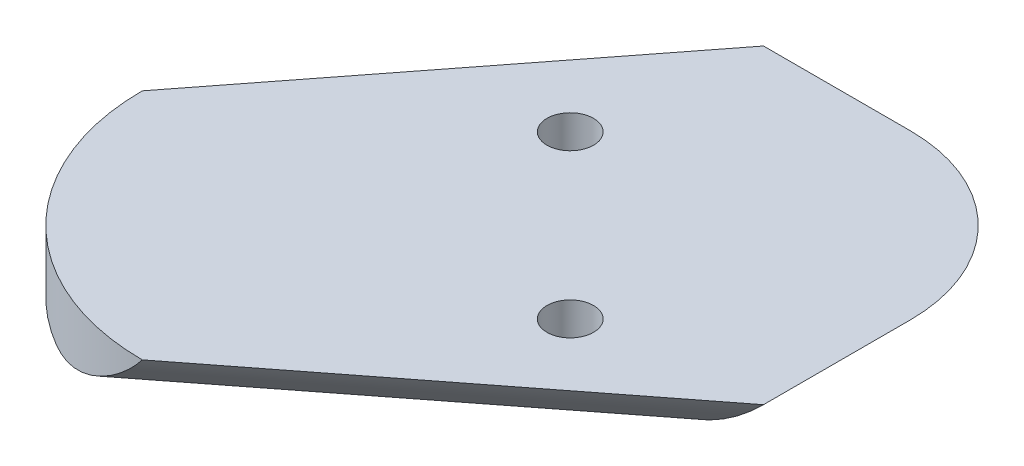
ISO-10303-21;
HEADER;
FILE_DESCRIPTION(('STEP AP214'),'2;1');
FILE_NAME('part.step','',(''),(''),'','','');
FILE_SCHEMA(('AUTOMOTIVE_DESIGN { 1 0 10303 214 1 1 1 1 }'));
ENDSEC;
DATA;
#1=APPLICATION_CONTEXT('core data for automotive mechanical design processes');
#2=APPLICATION_PROTOCOL_DEFINITION('international standard','automotive_design',2000,#1);
#3=PRODUCT_CONTEXT('',#1,'mechanical');
#4=PRODUCT('Part','Part','',(#3));
#5=PRODUCT_RELATED_PRODUCT_CATEGORY('part','',(#4));
#6=PRODUCT_DEFINITION_FORMATION('','',#4);
#7=PRODUCT_DEFINITION_CONTEXT('part definition',#1,'design');
#8=PRODUCT_DEFINITION('design','',#6,#7);
#9=PRODUCT_DEFINITION_SHAPE('','',#8);
#10=(LENGTH_UNIT() NAMED_UNIT(*) SI_UNIT(.MILLI.,.METRE.));
#11=(NAMED_UNIT(*) PLANE_ANGLE_UNIT() SI_UNIT($,.RADIAN.));
#12=(NAMED_UNIT(*) SI_UNIT($,.STERADIAN.) SOLID_ANGLE_UNIT());
#13=UNCERTAINTY_MEASURE_WITH_UNIT(LENGTH_MEASURE(1.E-05),#10,'distance_accuracy_value','');
#14=(GEOMETRIC_REPRESENTATION_CONTEXT(3) GLOBAL_UNCERTAINTY_ASSIGNED_CONTEXT((#13)) GLOBAL_UNIT_ASSIGNED_CONTEXT((#10,
#11,#12)) REPRESENTATION_CONTEXT('',''));
#15=CARTESIAN_POINT('',(0.,0.,0.));
#16=DIRECTION('',(0.,0.,1.));
#17=DIRECTION('',(1.,0.,0.));
#18=AXIS2_PLACEMENT_3D('',#15,#16,#17);
#19=CARTESIAN_POINT('',(-25.,8.,25.));
#20=DIRECTION('',(0.,-1.,0.));
#21=DIRECTION('',(0.,0.,-1.));
#22=AXIS2_PLACEMENT_3D('',#19,#20,#21);
#23=CYLINDRICAL_SURFACE('',#22,30.);
#24=CARTESIAN_POINT('',(-25.,8.,25.));
#25=DIRECTION('',(0.,1.,0.));
#26=DIRECTION('',(0.,0.,1.));
#27=AXIS2_PLACEMENT_3D('',#24,#25,#26);
#28=CIRCLE('',#27,30.);
#29=CARTESIAN_POINT('',(-55.,8.,25.));
#30=VERTEX_POINT('',#29);
#31=CARTESIAN_POINT('',(-25.,8.,55.));
#32=VERTEX_POINT('',#31);
#33=EDGE_CURVE('E107',#30,#32,#28,.T.);
#34=ORIENTED_EDGE('',*,*,#33,.F.);
#35=CARTESIAN_POINT('',(-55.,8.,25.));
#36=CARTESIAN_POINT('',(-55.0000149337181,7.76366710785229,25.1826639288907));
#37=CARTESIAN_POINT('',(-54.9983328483194,7.5326924174558,25.3721243054726));
#38=CARTESIAN_POINT('',(-54.9909311101144,7.08119971930185,25.7628691667828));
#39=CARTESIAN_POINT('',(-54.9852132248712,6.8606771789109,25.9641484398091));
#40=CARTESIAN_POINT('',(-54.9691065514288,6.42986492629269,26.3766933030417));
#41=CARTESIAN_POINT('',(-54.9587230177196,6.21956399685019,26.5879474206405));
#42=CARTESIAN_POINT('',(-54.9327390787841,5.80864267595741,27.0193740201955));
#43=CARTESIAN_POINT('',(-54.9171380086402,5.60802352207357,27.2395476356987));
#44=CARTESIAN_POINT('',(-54.8614996349122,5.01782538355453,27.9146745524815));
#45=CARTESIAN_POINT('',(-54.8127149467977,4.64261384498823,28.3816072991131));
#46=CARTESIAN_POINT('',(-54.6883335452686,3.929935906382,29.3401301031353));
#47=CARTESIAN_POINT('',(-54.6127290996289,3.5924804284846,29.8317272362215));
#48=CARTESIAN_POINT('',(-54.4418864734662,2.99224401711152,30.7774985448942));
#49=CARTESIAN_POINT('',(-54.3498297468502,2.7253337202278,31.2296294283354));
#50=CARTESIAN_POINT('',(-54.1403680596482,2.22356097345311,32.1455999375864));
#51=CARTESIAN_POINT('',(-54.0229677738494,1.98869262623428,32.6094373901267));
#52=CARTESIAN_POINT('',(-53.7618390615891,1.55423119319321,33.5434602960041));
#53=CARTESIAN_POINT('',(-53.6182326042672,1.35448277501645,34.0136073614406));
#54=CARTESIAN_POINT('',(-53.3031729899518,0.991906905351658,34.9588354235181));
#55=CARTESIAN_POINT('',(-53.131723935377,0.829074023065014,35.4339156836477));
#56=CARTESIAN_POINT('',(-52.803655130755,0.577040831124523,36.274318537783));
#57=CARTESIAN_POINT('',(-52.6528760801568,0.479523761588807,36.6394433949175));
#58=CARTESIAN_POINT('',(-52.3346787439705,0.310018018249884,37.3682390112918));
#59=CARTESIAN_POINT('',(-52.1672668919756,0.238019522662679,37.7319102765983));
#60=CARTESIAN_POINT('',(-51.8150361214636,0.120938529084424,38.4579917114956));
#61=CARTESIAN_POINT('',(-51.6301186388317,0.0760203870469298,38.8203811680424));
#62=CARTESIAN_POINT('',(-51.3409067021667,0.0306647178497149,39.3596086406653));
#63=CARTESIAN_POINT('',(-51.2424686405056,0.0192161762753081,39.5387292120168));
#64=CARTESIAN_POINT('',(-51.0417999204024,0.00388325095041707,39.895184239232));
#65=CARTESIAN_POINT('',(-50.9395688597326,-3.28225569687759E-07,40.0725185031171));
#66=CARTESIAN_POINT('',(-50.8355137729064,0.,40.2488107106739));
#67=B_SPLINE_CURVE_WITH_KNOTS('',3,(#35,#36,#37,#38,#39,#40,#41,#42,#43,#44,#45,#46,#47,#48,#49,
#50,#51,#52,#53,#54,#55,#56,#57,#58,#59,#60,#61,#62,#63,#64,#65,#66),.UNSPECIFIED.,.F.,.F.,(4,2,
2,2,2,2,2,2,2,2,2,2,2,2,2,4),(0.,0.895836012346807,1.79127991780151,2.68571788510424,
3.5802698821434,5.38065166809804,7.18155293250976,8.77907749719142,10.3763076393121,
11.9662852153713,13.5560287311848,14.7756521725298,15.994805684811,17.2212858803042,
17.8352495380648,18.4492784906028),.UNSPECIFIED.);
#68=CARTESIAN_POINT('',(-50.8355137729064,0.,40.2488107106739));
#69=VERTEX_POINT('',#68);
#70=EDGE_CURVE('E150',#30,#69,#67,.T.);
#71=ORIENTED_EDGE('',*,*,#70,.T.);
#72=CARTESIAN_POINT('',(-25.,0.,25.));
#73=DIRECTION('',(0.,1.,0.));
#74=DIRECTION('',(0.,0.,1.));
#75=AXIS2_PLACEMENT_3D('',#72,#73,#74);
#76=CIRCLE('',#75,30.);
#77=CARTESIAN_POINT('',(-40.2488107106739,0.,50.8355137729064));
#78=VERTEX_POINT('',#77);
#79=EDGE_CURVE('E109',#69,#78,#76,.T.);
#80=ORIENTED_EDGE('',*,*,#79,.T.);
#81=CARTESIAN_POINT('',(-40.2488107106739,0.,50.8355137729064));
#82=CARTESIAN_POINT('',(-40.051615194468,-4.48527421998889E-07,50.9519080136923));
#83=CARTESIAN_POINT('',(-39.8531197647859,0.00485885932003756,51.0660159615653));
#84=CARTESIAN_POINT('',(-39.4539463294067,0.0240123220044344,51.2894601317774));
#85=CARTESIAN_POINT('',(-39.2532686435908,0.038305111912048,51.3987970419978));
#86=CARTESIAN_POINT('',(-38.6490479020251,0.0948578754571697,51.7191125787953));
#87=CARTESIAN_POINT('',(-38.2427808139363,0.150793813567319,51.9227123148687));
#88=CARTESIAN_POINT('',(-37.4300547630347,0.296018579970776,52.3074040892245));
#89=CARTESIAN_POINT('',(-37.0236266216139,0.385020652851024,52.4886722965869));
#90=CARTESIAN_POINT('',(-36.2098924619952,0.593987771074424,52.8304346285862));
#91=CARTESIAN_POINT('',(-35.8025862290288,0.713961518406383,52.9909228957057));
#92=CARTESIAN_POINT('',(-34.9917754515233,0.9818815068822,53.2904641353349));
#93=CARTESIAN_POINT('',(-34.5882620405258,1.1296915218013,53.4296157488899));
#94=CARTESIAN_POINT('',(-33.7853994673645,1.45157647322055,53.6878821199211));
#95=CARTESIAN_POINT('',(-33.3860500161629,1.62564957353909,53.8069982769445));
#96=CARTESIAN_POINT('',(-32.5920663387716,1.99903005810294,54.0263813601196));
#97=CARTESIAN_POINT('',(-32.1974561136947,2.19843179361472,54.1265741335443));
#98=CARTESIAN_POINT('',(-31.4165477532986,2.62053075620023,54.3085086396697));
#99=CARTESIAN_POINT('',(-31.0302499819026,2.84322900071442,54.3902495660207));
#100=CARTESIAN_POINT('',(-30.1980729428415,3.35380830165616,54.5498030416914));
#101=CARTESIAN_POINT('',(-29.7542587362562,3.64615351348757,54.6241461520196));
#102=CARTESIAN_POINT('',(-28.8846578843716,4.26123855302292,54.7506727500767));
#103=CARTESIAN_POINT('',(-28.4588782204883,4.58398999829307,54.8028477255438));
#104=CARTESIAN_POINT('',(-27.6314262808204,5.25860444306934,54.8872535752973));
#105=CARTESIAN_POINT('',(-27.2296749413833,5.61036174155972,54.9195535254605));
#106=CARTESIAN_POINT('',(-26.4546607285204,6.34468331017928,54.9672202337607));
#107=CARTESIAN_POINT('',(-26.0813719094781,6.72721885370768,54.9826025894755));
#108=CARTESIAN_POINT('',(-25.600378262749,7.26749638442816,54.9942582425137));
#109=CARTESIAN_POINT('',(-25.4766987266299,7.41104918469624,54.9964573374619));
#110=CARTESIAN_POINT('',(-25.23442755038,7.70234331613614,54.9993283430818));
#111=CARTESIAN_POINT('',(-25.1158347772122,7.85008370225097,55.0000005955972));
#112=CARTESIAN_POINT('',(-25.,8.,55.));
#113=B_SPLINE_CURVE_WITH_KNOTS('',3,(#81,#82,#83,#84,#85,#86,#87,#88,#89,#90,#91,#92,#93,#94,
#95,#96,#97,#98,#99,#100,#101,#102,#103,#104,#105,#106,#107,#108,#109,#110,#111,#112),
.UNSPECIFIED.,.F.,.F.,(4,2,2,2,2,2,2,2,2,2,2,2,2,2,2,4),(0.,0.68680716080374,1.37351496934495,
2.74506990704209,4.1049980362695,5.4653086757702,6.81912747169389,8.1728516593039,
9.5317751917251,10.8907580979119,12.4989613489588,14.1077815712638,15.7109782633747,
17.3126956078892,17.8810866326439,18.4493503881755),.UNSPECIFIED.);
#114=EDGE_CURVE('E137',#78,#32,#113,.T.);
#115=ORIENTED_EDGE('',*,*,#114,.T.);
#116=EDGE_LOOP('',(#34,#71,#80,#115));
#117=FACE_BOUND('',#116,.T.);
#118=ADVANCED_FACE('F39',(#117),#23,.T.);
#119=CARTESIAN_POINT('',(-1.082,8.,1.082));
#120=DIRECTION('',(0.,-1.,0.));
#121=DIRECTION('',(0.,0.,-1.));
#122=AXIS2_PLACEMENT_3D('',#119,#120,#121);
#123=PLANE('',#122);
#124=CARTESIAN_POINT('',(-22.88,8.,2.01));
#125=DIRECTION('',(0.,1.,0.));
#126=DIRECTION('',(0.,0.,1.));
#127=AXIS2_PLACEMENT_3D('',#124,#125,#126);
#128=CIRCLE('',#127,3.);
#129=CARTESIAN_POINT('',(-22.88,8.,5.01000000000001));
#130=VERTEX_POINT('',#129);
#131=EDGE_CURVE('E215',#130,#130,#128,.T.);
#132=ORIENTED_EDGE('',*,*,#131,.F.);
#133=EDGE_LOOP('',(#132));
#134=FACE_BOUND('',#133,.T.);
#135=CARTESIAN_POINT('',(-2.01,8.,22.88));
#136=DIRECTION('',(0.,1.,0.));
#137=DIRECTION('',(0.,0.,1.));
#138=AXIS2_PLACEMENT_3D('',#135,#136,#137);
#139=CIRCLE('',#138,3.);
#140=CARTESIAN_POINT('',(-2.01,8.,25.88));
#141=VERTEX_POINT('',#140);
#142=EDGE_CURVE('E214',#141,#141,#139,.T.);
#143=ORIENTED_EDGE('',*,*,#142,.F.);
#144=EDGE_LOOP('',(#143));
#145=FACE_BOUND('',#144,.T.);
#146=DIRECTION('',(0.789352217376326,0.,-0.61394061351492));
#147=VECTOR('',#146,1.);
#148=CARTESIAN_POINT('',(-25.,8.,55.));
#149=LINE('',#148,#147);
#150=CARTESIAN_POINT('',(20.,8.,20.));
#151=VERTEX_POINT('',#150);
#152=EDGE_CURVE('E99',#32,#151,#149,.T.);
#153=ORIENTED_EDGE('',*,*,#152,.T.);
#154=DIRECTION('',(0.,0.,-1.));
#155=VECTOR('',#154,1.);
#156=CARTESIAN_POINT('',(20.,8.,1.082));
#157=LINE('',#156,#155);
#158=CARTESIAN_POINT('',(20.,8.,1.082));
#159=VERTEX_POINT('',#158);
#160=EDGE_CURVE('E106',#151,#159,#157,.T.);
#161=ORIENTED_EDGE('',*,*,#160,.T.);
#162=CARTESIAN_POINT('',(-1.082,8.,1.082));
#163=DIRECTION('',(0.,1.,0.));
#164=DIRECTION('',(0.,0.,-1.));
#165=AXIS2_PLACEMENT_3D('',#162,#163,#164);
#166=CIRCLE('',#165,21.082);
#167=CARTESIAN_POINT('',(-1.082,8.,-20.));
#168=VERTEX_POINT('',#167);
#169=EDGE_CURVE('E116',#159,#168,#166,.T.);
#170=ORIENTED_EDGE('',*,*,#169,.T.);
#171=DIRECTION('',(-1.,0.,0.));
#172=VECTOR('',#171,1.);
#173=CARTESIAN_POINT('',(-20.,8.,-20.));
#174=LINE('',#173,#172);
#175=CARTESIAN_POINT('',(-20.,8.,-20.));
#176=VERTEX_POINT('',#175);
#177=EDGE_CURVE('E117',#168,#176,#174,.T.);
#178=ORIENTED_EDGE('',*,*,#177,.T.);
#179=DIRECTION('',(-0.61394061351492,0.,0.789352217376326));
#180=VECTOR('',#179,1.);
#181=CARTESIAN_POINT('',(-20.,8.,-20.));
#182=LINE('',#181,#180);
#183=EDGE_CURVE('E121',#176,#30,#182,.T.);
#184=ORIENTED_EDGE('',*,*,#183,.T.);
#185=ORIENTED_EDGE('',*,*,#33,.T.);
#186=EDGE_LOOP('',(#153,#161,#170,#178,#184,#185));
#187=FACE_BOUND('',#186,.T.);
#188=ADVANCED_FACE('F102',(#134,#145,#187),#123,.F.);
#189=CARTESIAN_POINT('',(-1.082,0.,1.082));
#190=DIRECTION('',(0.,-1.,0.));
#191=DIRECTION('',(0.,0.,-1.));
#192=AXIS2_PLACEMENT_3D('',#189,#190,#191);
#193=PLANE('',#192);
#194=ORIENTED_EDGE('',*,*,#79,.F.);
#195=DIRECTION('',(-0.61394061351492,0.,0.789352217376327));
#196=VECTOR('',#195,1.);
#197=CARTESIAN_POINT('',(-25.0752310382176,0.,7.12844719464541));
#198=LINE('',#197,#196);
#199=CARTESIAN_POINT('',(-19.0351622348762,0.,-0.63735555250781));
#200=VERTEX_POINT('',#199);
#201=EDGE_CURVE('E58',#69,#200,#198,.F.);
#202=ORIENTED_EDGE('',*,*,#201,.T.);
#203=DIRECTION('',(-1.,0.,0.));
#204=VECTOR('',#203,1.);
#205=CARTESIAN_POINT('',(-1.082,0.,-0.63735555250781));
#206=LINE('',#205,#204);
#207=CARTESIAN_POINT('',(-1.082,0.,-0.63735555250781));
#208=VERTEX_POINT('',#207);
#209=EDGE_CURVE('E130',#200,#208,#206,.F.);
#210=ORIENTED_EDGE('',*,*,#209,.T.);
#211=CARTESIAN_POINT('',(-1.082,0.,1.082));
#212=DIRECTION('',(0.,-1.,0.));
#213=DIRECTION('',(0.,0.,-1.));
#214=AXIS2_PLACEMENT_3D('',#211,#212,#213);
#215=CIRCLE('',#214,1.71935555250781);
#216=CARTESIAN_POINT('',(0.637355552507807,0.,1.082));
#217=VERTEX_POINT('',#216);
#218=EDGE_CURVE('E134',#208,#217,#215,.T.);
#219=ORIENTED_EDGE('',*,*,#218,.T.);
#220=DIRECTION('',(0.,0.,-1.));
#221=VECTOR('',#220,1.);
#222=CARTESIAN_POINT('',(0.63735555250781,0.,20.));
#223=LINE('',#222,#221);
#224=CARTESIAN_POINT('',(0.63735555250781,0.,19.0351622348762));
#225=VERTEX_POINT('',#224);
#226=EDGE_CURVE('E135',#217,#225,#223,.F.);
#227=ORIENTED_EDGE('',*,*,#226,.T.);
#228=DIRECTION('',(0.789352217376326,0.,-0.61394061351492));
#229=VECTOR('',#228,1.);
#230=CARTESIAN_POINT('',(-32.7658027471532,0.,45.0153964679459));
#231=LINE('',#230,#229);
#232=EDGE_CURVE('E103',#225,#78,#231,.F.);
#233=ORIENTED_EDGE('',*,*,#232,.T.);
#234=EDGE_LOOP('',(#194,#202,#210,#219,#227,#233));
#235=FACE_BOUND('',#234,.T.);
#236=ADVANCED_FACE('F159',(#235),#193,.T.);
#237=CARTESIAN_POINT('',(-20.,27.432,-0.63735555250781));
#238=DIRECTION('',(1.,0.,0.));
#239=DIRECTION('',(0.,0.,-1.));
#240=AXIS2_PLACEMENT_3D('',#237,#238,#239);
#241=CYLINDRICAL_SURFACE('',#240,27.432);
#242=ORIENTED_EDGE('',*,*,#209,.F.);
#243=CARTESIAN_POINT('',(-20.,8.,-20.));
#244=CARTESIAN_POINT('',(-20.0372967926702,7.79236979310809,-19.7916293918657));
#245=CARTESIAN_POINT('',(-20.0713223137476,7.58782621580646,-19.5796454557742));
#246=CARTESIAN_POINT('',(-20.1331407012948,7.18525314121595,-19.1487247228265));
#247=CARTESIAN_POINT('',(-20.1609339963947,6.98722319674261,-18.9297884053132));
#248=CARTESIAN_POINT('',(-20.2354062514042,6.40361605340591,-18.2631956680416));
#249=CARTESIAN_POINT('',(-20.2732234243,6.02826115336075,-17.8054943049104));
#250=CARTESIAN_POINT('',(-20.3275835074237,5.30824172598302,-16.8670534288009));
#251=CARTESIAN_POINT('',(-20.3441725844747,4.96351212061977,-16.3863662769956));
#252=CARTESIAN_POINT('',(-20.3586324355539,4.30568002033883,-15.4034557127056));
#253=CARTESIAN_POINT('',(-20.3565001696977,3.99258267006819,-14.9012288158728));
#254=CARTESIAN_POINT('',(-20.3344000357686,3.35837919717947,-13.8066096261815));
#255=CARTESIAN_POINT('',(-20.3119912480983,3.0422228242905,-13.2113963977936));
#256=CARTESIAN_POINT('',(-20.249206972584,2.45485570551521,-12.0000137392876));
#257=CARTESIAN_POINT('',(-20.2088297125905,2.18364939647265,-11.383842247688));
#258=CARTESIAN_POINT('',(-20.1371669322662,1.81153548050512,-10.4465174549723));
#259=CARTESIAN_POINT('',(-20.1114138899693,1.69322863652229,-10.131734077703));
#260=CARTESIAN_POINT('',(-20.0565971354854,1.4683715142588,-9.49836713037835));
#261=CARTESIAN_POINT('',(-20.0275342022246,1.36181848149141,-9.17978447015402));
#262=CARTESIAN_POINT('',(-19.935942561727,1.05994625632532,-8.21891268564309));
#263=CARTESIAN_POINT('',(-19.8689999914134,0.882358352656274,-7.57135964013735));
#264=CARTESIAN_POINT('',(-19.7416725045913,0.608331861732623,-6.40646088926796));
#265=CARTESIAN_POINT('',(-19.6829733236929,0.502654912117003,-5.89106182139308));
#266=CARTESIAN_POINT('',(-19.5615276036227,0.321147284276793,-4.85547684477725));
#267=CARTESIAN_POINT('',(-19.4987810910989,0.245316409566687,-4.33529096757236));
#268=CARTESIAN_POINT('',(-19.370707031087,0.123774444690167,-3.29263772719278));
#269=CARTESIAN_POINT('',(-19.3053838994381,0.0780140100735406,-2.77017552504671));
#270=CARTESIAN_POINT('',(-19.1733985285384,0.0165137153097022,-1.72375952840301));
#271=CARTESIAN_POINT('',(-19.1067367194163,0.000764363496605935,-1.19980625801088));
#272=CARTESIAN_POINT('',(-19.0384365971226,9.04654260431984E-06,-0.663086209693564));
#273=CARTESIAN_POINT('',(-19.0367994113148,-4.14908947051448E-09,-0.650220844487761));
#274=CARTESIAN_POINT('',(-19.0351622348762,0.,-0.63735555250782));
#275=B_SPLINE_CURVE_WITH_KNOTS('',3,(#243,#244,#245,#246,#247,#248,#249,#250,#251,#252,#253,
#254,#255,#256,#257,#258,#259,#260,#261,#262,#263,#264,#265,#266,#267,#268,#269,#270,#271,#272,
#273,#274),.UNSPECIFIED.,.F.,.F.,(4,2,2,2,2,2,2,2,2,2,2,2,2,2,2,4),(0.,0.889417554324916,
1.77877391892413,3.55637469659784,5.33010294428028,7.10411920701068,9.12502913821371,
11.1461384268325,12.1577252612835,13.169074526087,15.1913207728969,16.7786739315549,
18.3660166400239,19.9507480313112,21.5349781331532,21.5738854791451),.UNSPECIFIED.);
#276=EDGE_CURVE('E52',#200,#176,#275,.F.);
#277=ORIENTED_EDGE('',*,*,#276,.T.);
#278=ORIENTED_EDGE('',*,*,#177,.F.);
#279=CARTESIAN_POINT('',(-1.082,27.432,-0.637355552507807));
#280=DIRECTION('',(1.,0.,0.));
#281=DIRECTION('',(0.,0.,-1.));
#282=AXIS2_PLACEMENT_3D('',#279,#280,#281);
#283=CIRCLE('',#282,27.432);
#284=EDGE_CURVE('E129',#208,#168,#283,.T.);
#285=ORIENTED_EDGE('',*,*,#284,.F.);
#286=EDGE_LOOP('',(#242,#277,#278,#285));
#287=FACE_BOUND('',#286,.T.);
#288=ADVANCED_FACE('F170',(#287),#241,.T.);
#289=CARTESIAN_POINT('',(-1.082,27.432,1.082));
#290=DIRECTION('',(0.,1.,0.));
#291=DIRECTION('',(0.,0.,1.));
#292=AXIS2_PLACEMENT_3D('',#289,#290,#291);
#293=DEGENERATE_TOROIDAL_SURFACE('',#292,1.71935555250781,27.432,.T.);
#294=ORIENTED_EDGE('',*,*,#284,.T.);
#295=ORIENTED_EDGE('',*,*,#169,.F.);
#296=CARTESIAN_POINT('',(0.637355552507807,27.432,1.082));
#297=DIRECTION('',(0.,0.,1.));
#298=DIRECTION('',(1.,0.,0.));
#299=AXIS2_PLACEMENT_3D('',#296,#297,#298);
#300=CIRCLE('',#299,27.432);
#301=EDGE_CURVE('E112',#217,#159,#300,.T.);
#302=ORIENTED_EDGE('',*,*,#301,.F.);
#303=ORIENTED_EDGE('',*,*,#218,.F.);
#304=EDGE_LOOP('',(#294,#295,#302,#303));
#305=FACE_BOUND('',#304,.T.);
#306=ADVANCED_FACE('F165',(#305),#293,.T.);
#307=CARTESIAN_POINT('',(0.63735555250781,27.432,1.082));
#308=DIRECTION('',(0.,0.,1.));
#309=DIRECTION('',(1.,0.,0.));
#310=AXIS2_PLACEMENT_3D('',#307,#308,#309);
#311=CYLINDRICAL_SURFACE('',#310,27.432);
#312=ORIENTED_EDGE('',*,*,#160,.F.);
#313=CARTESIAN_POINT('',(20.,8.,20.));
#314=CARTESIAN_POINT('',(19.7916293918658,7.79236979310823,20.0372967926702));
#315=CARTESIAN_POINT('',(19.5796454557744,7.58782621580674,20.0713223137475));
#316=CARTESIAN_POINT('',(19.1487247228271,7.1852531412165,20.1331407012947));
#317=CARTESIAN_POINT('',(18.929788405314,6.98722319674329,20.1609339963946));
#318=CARTESIAN_POINT('',(18.2631956680429,6.40361605340698,20.235406251404));
#319=CARTESIAN_POINT('',(17.805494304912,6.02826115336206,20.2732234242999));
#320=CARTESIAN_POINT('',(16.8670534288026,5.30824172598425,20.3275835074237));
#321=CARTESIAN_POINT('',(16.386366276997,4.96351212062074,20.3441725844747));
#322=CARTESIAN_POINT('',(15.4034557127063,4.30568002033928,20.3586324355539));
#323=CARTESIAN_POINT('',(14.9012288158731,3.99258267006841,20.3565001696978));
#324=CARTESIAN_POINT('',(13.8066096261814,3.35837919717939,20.3344000357686));
#325=CARTESIAN_POINT('',(13.2113963977933,3.04222282429034,20.3119912480983));
#326=CARTESIAN_POINT('',(12.000013739287,2.45485570551493,20.2492069725839));
#327=CARTESIAN_POINT('',(11.3838422476872,2.18364939647232,20.2088297125905));
#328=CARTESIAN_POINT('',(10.4465174549714,1.81153548050479,20.1371669322662));
#329=CARTESIAN_POINT('',(10.1317340777022,1.69322863652201,20.1114138899693));
#330=CARTESIAN_POINT('',(9.49836713037775,1.4683715142586,20.0565971354853));
#331=CARTESIAN_POINT('',(9.17978447015351,1.36181848149125,20.0275342022246));
#332=CARTESIAN_POINT('',(8.21891268564281,1.05994625632525,19.9359425617269));
#333=CARTESIAN_POINT('',(7.57135964013722,0.88235835265624,19.8689999914132));
#334=CARTESIAN_POINT('',(6.40646088926794,0.608331861732621,19.7416725045914));
#335=CARTESIAN_POINT('',(5.89106182139303,0.502654912117003,19.6829733236934));
#336=CARTESIAN_POINT('',(4.85547684477738,0.321147284276804,19.5615276036222));
#337=CARTESIAN_POINT('',(4.3352909675727,0.245316409566706,19.4987810910971));
#338=CARTESIAN_POINT('',(3.29263772719269,0.123774444690185,19.3707070310888));
#339=CARTESIAN_POINT('',(2.77017552504598,0.0780140100735561,19.3053838994448));
#340=CARTESIAN_POINT('',(1.72375952840392,0.0165137153096953,19.1733985285316));
#341=CARTESIAN_POINT('',(1.19980625801406,0.000764363496580622,19.1067367193913));
#342=CARTESIAN_POINT('',(0.663086209693683,9.04654260310433E-06,19.0384365971214));
#343=CARTESIAN_POINT('',(0.650220844487814,-4.14909008347377E-09,19.0367994113142));
#344=CARTESIAN_POINT('',(0.637355552507804,0.,19.0351622348762));
#345=B_SPLINE_CURVE_WITH_KNOTS('',3,(#313,#314,#315,#316,#317,#318,#319,#320,#321,#322,#323,
#324,#325,#326,#327,#328,#329,#330,#331,#332,#333,#334,#335,#336,#337,#338,#339,#340,#341,#342,
#343,#344),.UNSPECIFIED.,.F.,.F.,(4,2,2,2,2,2,2,2,2,2,2,2,2,2,2,4),(0.,0.889417554324302,
1.77877391892291,3.55637469659533,5.330102944279,7.10411920701067,9.12502913821421,
11.1461384268335,12.1577252612843,13.1690745260874,15.1913207728969,16.7786739315548,
18.3660166400238,19.9507480313111,21.5349781331533,21.5738854791451),.UNSPECIFIED.);
#346=EDGE_CURVE('E11',#151,#225,#345,.T.);
#347=ORIENTED_EDGE('',*,*,#346,.T.);
#348=ORIENTED_EDGE('',*,*,#226,.F.);
#349=ORIENTED_EDGE('',*,*,#301,.T.);
#350=EDGE_LOOP('',(#312,#347,#348,#349));
#351=FACE_BOUND('',#350,.T.);
#352=ADVANCED_FACE('F115',(#351),#311,.T.);
#353=CARTESIAN_POINT('',(-10.0153964679459,14.,-12.2341972528468));
#354=DIRECTION('',(0.61394061351492,0.,-0.789352217376327));
#355=DIRECTION('',(-0.789352217376326,0.,-0.61394061351492));
#356=AXIS2_PLACEMENT_3D('',#353,#354,#355);
#357=CYLINDRICAL_SURFACE('',#356,14.);
#358=ORIENTED_EDGE('',*,*,#276,.F.);
#359=ORIENTED_EDGE('',*,*,#201,.F.);
#360=ORIENTED_EDGE('',*,*,#70,.F.);
#361=ORIENTED_EDGE('',*,*,#183,.F.);
#362=EDGE_LOOP('',(#358,#359,#360,#361));
#363=FACE_BOUND('',#362,.T.);
#364=ADVANCED_FACE('F161',(#363),#357,.T.);
#365=CARTESIAN_POINT('',(-32.7658027471532,14.,45.0153964679459));
#366=DIRECTION('',(-0.789352217376326,0.,0.61394061351492));
#367=DIRECTION('',(0.61394061351492,0.,0.789352217376326));
#368=AXIS2_PLACEMENT_3D('',#365,#366,#367);
#369=CYLINDRICAL_SURFACE('',#368,14.);
#370=ORIENTED_EDGE('',*,*,#114,.F.);
#371=ORIENTED_EDGE('',*,*,#232,.F.);
#372=ORIENTED_EDGE('',*,*,#346,.F.);
#373=ORIENTED_EDGE('',*,*,#152,.F.);
#374=EDGE_LOOP('',(#370,#371,#372,#373));
#375=FACE_BOUND('',#374,.T.);
#376=ADVANCED_FACE('F41',(#375),#369,.T.);
#377=CARTESIAN_POINT('',(-2.01,2.,22.88));
#378=DIRECTION('',(0.,1.,0.));
#379=DIRECTION('',(0.,0.,1.));
#380=AXIS2_PLACEMENT_3D('',#377,#378,#379);
#381=CYLINDRICAL_SURFACE('',#380,3.);
#382=CARTESIAN_POINT('',(-2.01,2.,22.88));
#383=DIRECTION('',(0.,1.,0.));
#384=DIRECTION('',(0.,0.,1.));
#385=AXIS2_PLACEMENT_3D('',#382,#383,#384);
#386=CIRCLE('',#385,3.);
#387=CARTESIAN_POINT('',(-2.01,2.,25.88));
#388=VERTEX_POINT('',#387);
#389=EDGE_CURVE('E218',#388,#388,#386,.T.);
#390=ORIENTED_EDGE('',*,*,#389,.F.);
#391=EDGE_LOOP('',(#390));
#392=FACE_BOUND('',#391,.T.);
#393=ORIENTED_EDGE('',*,*,#142,.T.);
#394=EDGE_LOOP('',(#393));
#395=FACE_BOUND('',#394,.T.);
#396=ADVANCED_FACE('F189',(#392,#395),#381,.F.);
#397=CARTESIAN_POINT('',(-2.01,2.,22.88));
#398=DIRECTION('',(0.,1.,0.));
#399=DIRECTION('',(0.,0.,1.));
#400=AXIS2_PLACEMENT_3D('',#397,#398,#399);
#401=PLANE('',#400);
#402=ORIENTED_EDGE('',*,*,#389,.T.);
#403=EDGE_LOOP('',(#402));
#404=FACE_BOUND('',#403,.T.);
#405=ADVANCED_FACE('F192',(#404),#401,.T.);
#406=CARTESIAN_POINT('',(-22.88,2.,2.01));
#407=DIRECTION('',(0.,1.,0.));
#408=DIRECTION('',(0.,0.,1.));
#409=AXIS2_PLACEMENT_3D('',#406,#407,#408);
#410=CYLINDRICAL_SURFACE('',#409,3.);
#411=CARTESIAN_POINT('',(-22.88,2.,2.01));
#412=DIRECTION('',(0.,1.,0.));
#413=DIRECTION('',(0.,0.,1.));
#414=AXIS2_PLACEMENT_3D('',#411,#412,#413);
#415=CIRCLE('',#414,3.);
#416=CARTESIAN_POINT('',(-22.88,2.,5.01000000000001));
#417=VERTEX_POINT('',#416);
#418=EDGE_CURVE('E140',#417,#417,#415,.T.);
#419=ORIENTED_EDGE('',*,*,#418,.F.);
#420=EDGE_LOOP('',(#419));
#421=FACE_BOUND('',#420,.T.);
#422=ORIENTED_EDGE('',*,*,#131,.T.);
#423=EDGE_LOOP('',(#422));
#424=FACE_BOUND('',#423,.T.);
#425=ADVANCED_FACE('F200',(#421,#424),#410,.F.);
#426=CARTESIAN_POINT('',(-22.88,2.,2.01));
#427=DIRECTION('',(0.,1.,0.));
#428=DIRECTION('',(0.,0.,1.));
#429=AXIS2_PLACEMENT_3D('',#426,#427,#428);
#430=PLANE('',#429);
#431=ORIENTED_EDGE('',*,*,#418,.T.);
#432=EDGE_LOOP('',(#431));
#433=FACE_BOUND('',#432,.T.);
#434=ADVANCED_FACE('F221',(#433),#430,.T.);
#435=CLOSED_SHELL('',(#118,#188,#236,#288,#306,#352,#364,#376,#396,#405,#425,#434));
#436=MANIFOLD_SOLID_BREP('B2',#435);
#437=ADVANCED_BREP_SHAPE_REPRESENTATION('',(#18,#436),#14);
#438=SHAPE_DEFINITION_REPRESENTATION(#9,#437);
ENDSEC;
END-ISO-10303-21;
